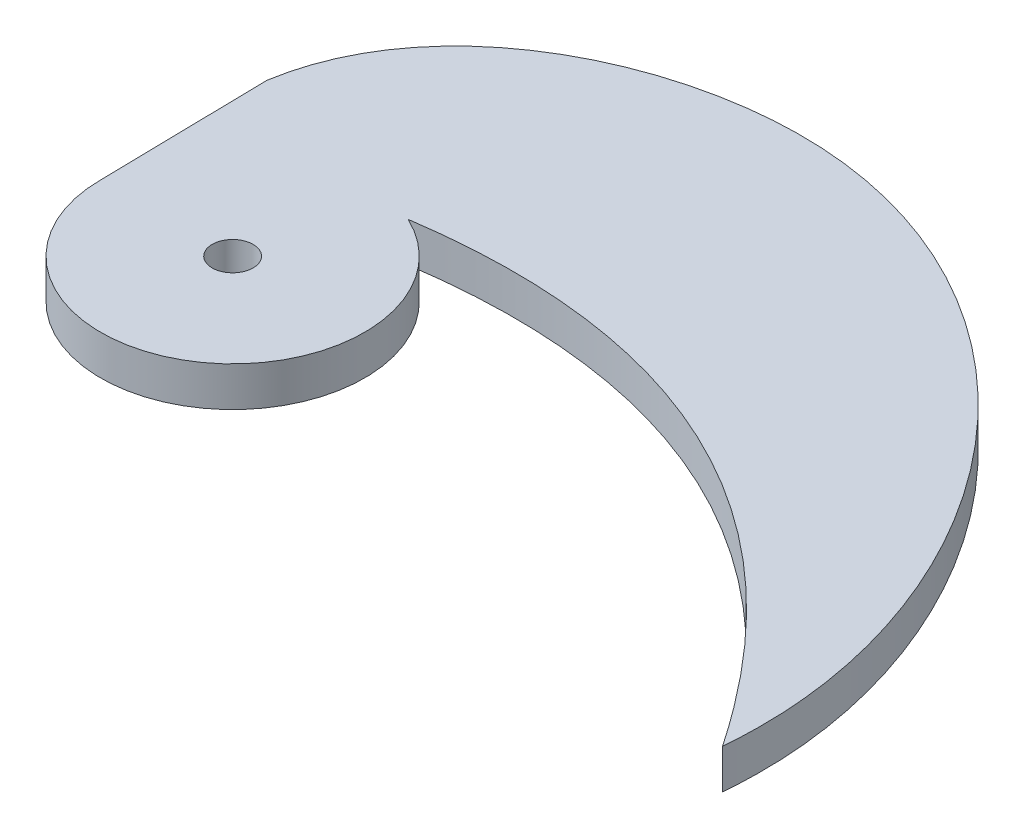
ISO-10303-21;
HEADER;
FILE_DESCRIPTION(('STEP AP214'),'2;1');
FILE_NAME('part.step','',(''),(''),'','','');
FILE_SCHEMA(('AUTOMOTIVE_DESIGN { 1 0 10303 214 1 1 1 1 }'));
ENDSEC;
DATA;
#1=APPLICATION_CONTEXT('core data for automotive mechanical design processes');
#2=APPLICATION_PROTOCOL_DEFINITION('international standard','automotive_design',2000,#1);
#3=PRODUCT_CONTEXT('',#1,'mechanical');
#4=PRODUCT('Part','Part','',(#3));
#5=PRODUCT_RELATED_PRODUCT_CATEGORY('part','',(#4));
#6=PRODUCT_DEFINITION_FORMATION('','',#4);
#7=PRODUCT_DEFINITION_CONTEXT('part definition',#1,'design');
#8=PRODUCT_DEFINITION('design','',#6,#7);
#9=PRODUCT_DEFINITION_SHAPE('','',#8);
#10=(LENGTH_UNIT() NAMED_UNIT(*) SI_UNIT(.MILLI.,.METRE.));
#11=(NAMED_UNIT(*) PLANE_ANGLE_UNIT() SI_UNIT($,.RADIAN.));
#12=(NAMED_UNIT(*) SI_UNIT($,.STERADIAN.) SOLID_ANGLE_UNIT());
#13=UNCERTAINTY_MEASURE_WITH_UNIT(LENGTH_MEASURE(1.E-05),#10,'distance_accuracy_value','');
#14=(GEOMETRIC_REPRESENTATION_CONTEXT(3) GLOBAL_UNCERTAINTY_ASSIGNED_CONTEXT((#13)) GLOBAL_UNIT_ASSIGNED_CONTEXT((#10,
#11,#12)) REPRESENTATION_CONTEXT('',''));
#15=CARTESIAN_POINT('',(0.,0.,0.));
#16=DIRECTION('',(0.,0.,1.));
#17=DIRECTION('',(1.,0.,0.));
#18=AXIS2_PLACEMENT_3D('',#15,#16,#17);
#19=CARTESIAN_POINT('',(0.,6.,0.));
#20=DIRECTION('',(0.,-1.,0.));
#21=DIRECTION('',(0.,0.,-1.));
#22=AXIS2_PLACEMENT_3D('',#19,#20,#21);
#23=CYLINDRICAL_SURFACE('',#22,20.);
#24=CARTESIAN_POINT('',(0.,0.,0.));
#25=DIRECTION('',(0.,1.,0.));
#26=DIRECTION('',(0.,0.,1.));
#27=AXIS2_PLACEMENT_3D('',#24,#25,#26);
#28=CIRCLE('',#27,20.);
#29=CARTESIAN_POINT('',(-20.,0.,0.));
#30=VERTEX_POINT('',#29);
#31=CARTESIAN_POINT('',(8.45236523481395,0.,-18.126155740733));
#32=VERTEX_POINT('',#31);
#33=EDGE_CURVE('E122',#30,#32,#28,.T.);
#34=ORIENTED_EDGE('',*,*,#33,.T.);
#35=DIRECTION('',(0.,-1.,0.));
#36=VECTOR('',#35,1.);
#37=CARTESIAN_POINT('',(8.45236523481395,6.,-18.126155740733));
#38=LINE('',#37,#36);
#39=CARTESIAN_POINT('',(8.45236523481395,6.,-18.126155740733));
#40=VERTEX_POINT('',#39);
#41=EDGE_CURVE('E11',#40,#32,#38,.T.);
#42=ORIENTED_EDGE('',*,*,#41,.F.);
#43=CARTESIAN_POINT('',(0.,6.,0.));
#44=DIRECTION('',(0.,1.,0.));
#45=DIRECTION('',(0.,0.,1.));
#46=AXIS2_PLACEMENT_3D('',#43,#44,#45);
#47=CIRCLE('',#46,20.);
#48=CARTESIAN_POINT('',(-20.,6.,0.));
#49=VERTEX_POINT('',#48);
#50=EDGE_CURVE('E85',#49,#40,#47,.T.);
#51=ORIENTED_EDGE('',*,*,#50,.F.);
#52=DIRECTION('',(0.,-1.,0.));
#53=VECTOR('',#52,1.);
#54=CARTESIAN_POINT('',(-20.,6.,0.));
#55=LINE('',#54,#53);
#56=EDGE_CURVE('E96',#49,#30,#55,.T.);
#57=ORIENTED_EDGE('',*,*,#56,.T.);
#58=EDGE_LOOP('',(#34,#42,#51,#57));
#59=FACE_BOUND('',#58,.T.);
#60=ADVANCED_FACE('F37',(#59),#23,.T.);
#61=CARTESIAN_POINT('',(8.45236523481394,6.,-18.126155740733));
#62=CARTESIAN_POINT('',(65.0149428370566,6.,-26.513222836221));
#63=CARTESIAN_POINT('',(101.422211760352,6.,27.1759997357647));
#64=B_SPLINE_CURVE_WITH_KNOTS('',2,(#61,#62,#63),.UNSPECIFIED.,.F.,.F.,(3,3),(0.,1.),.UNSPECIFIED.);
#65=DIRECTION('',(0.,-1.,0.));
#66=VECTOR('',#65,1.);
#67=SURFACE_OF_LINEAR_EXTRUSION('',#64,#66);
#68=CARTESIAN_POINT('',(8.45236523481394,0.,-18.126155740733));
#69=CARTESIAN_POINT('',(65.0149428370566,0.,-26.513222836221));
#70=CARTESIAN_POINT('',(101.422211760352,0.,27.1759997357647));
#71=B_SPLINE_CURVE_WITH_KNOTS('',2,(#68,#69,#70),.UNSPECIFIED.,.F.,.F.,(3,3),(0.,1.),.UNSPECIFIED.);
#72=CARTESIAN_POINT('',(101.422211760352,0.,27.1759997357648));
#73=VERTEX_POINT('',#72);
#74=EDGE_CURVE('E90',#32,#73,#71,.T.);
#75=ORIENTED_EDGE('',*,*,#74,.T.);
#76=DIRECTION('',(0.,-1.,0.));
#77=VECTOR('',#76,1.);
#78=CARTESIAN_POINT('',(101.422211760352,6.,27.1759997357648));
#79=LINE('',#78,#77);
#80=CARTESIAN_POINT('',(101.422211760352,6.,27.1759997357648));
#81=VERTEX_POINT('',#80);
#82=EDGE_CURVE('E46',#81,#73,#79,.T.);
#83=ORIENTED_EDGE('',*,*,#82,.F.);
#84=EDGE_CURVE('E80',#40,#81,#64,.T.);
#85=ORIENTED_EDGE('',*,*,#84,.F.);
#86=ORIENTED_EDGE('',*,*,#41,.T.);
#87=EDGE_LOOP('',(#75,#83,#85,#86));
#88=FACE_BOUND('',#87,.T.);
#89=ADVANCED_FACE('F89',(#88),#67,.F.);
#90=CARTESIAN_POINT('',(-20.4788011262157,6.,-25.6588248932317));
#91=CARTESIAN_POINT('',(-19.3693159811868,6.,-32.640094211247));
#92=CARTESIAN_POINT('',(-9.55582054644818,6.,-50.9886711432542));
#93=CARTESIAN_POINT('',(57.2952251743826,6.,-74.5843911636037));
#94=CARTESIAN_POINT('',(105.094597494465,6.,-12.8549022435383));
#95=CARTESIAN_POINT('',(101.422211760352,6.,27.1759997357648));
#96=B_SPLINE_CURVE_WITH_KNOTS('',3,(#90,#91,#92,#93,#94,#95),.UNSPECIFIED.,.F.,.F.,(4,1,1,4),
(0.0523550506600218,0.156265749931317,0.372181463072887,1.),.UNSPECIFIED.);
#97=DIRECTION('',(0.,-1.,0.));
#98=VECTOR('',#97,1.);
#99=SURFACE_OF_LINEAR_EXTRUSION('',#96,#98);
#100=CARTESIAN_POINT('',(-20.4788011262157,0.,-25.6588248932317));
#101=CARTESIAN_POINT('',(-19.3693159811868,0.,-32.640094211247));
#102=CARTESIAN_POINT('',(-9.55582054644818,0.,-50.9886711432542));
#103=CARTESIAN_POINT('',(57.2952251743826,0.,-74.5843911636037));
#104=CARTESIAN_POINT('',(105.094597494465,0.,-12.8549022435383));
#105=CARTESIAN_POINT('',(101.422211760352,0.,27.1759997357648));
#106=B_SPLINE_CURVE_WITH_KNOTS('',3,(#100,#101,#102,#103,#104,#105),.UNSPECIFIED.,.F.,.F.,(4,1,
1,4),(0.0523550506600218,0.156265749931317,0.372181463072887,1.),.UNSPECIFIED.);
#107=CARTESIAN_POINT('',(-20.4788011262157,0.,-25.6588248932317));
#108=VERTEX_POINT('',#107);
#109=EDGE_CURVE('E126',#108,#73,#106,.T.);
#110=ORIENTED_EDGE('',*,*,#109,.F.);
#111=DIRECTION('',(0.,-1.,0.));
#112=VECTOR('',#111,1.);
#113=CARTESIAN_POINT('',(-20.4788011262157,6.,-25.6588248932317));
#114=LINE('',#113,#112);
#115=CARTESIAN_POINT('',(-20.4788011262157,6.,-25.6588248932317));
#116=VERTEX_POINT('',#115);
#117=EDGE_CURVE('E70',#116,#108,#114,.T.);
#118=ORIENTED_EDGE('',*,*,#117,.F.);
#119=EDGE_CURVE('E83',#116,#81,#96,.T.);
#120=ORIENTED_EDGE('',*,*,#119,.T.);
#121=ORIENTED_EDGE('',*,*,#82,.T.);
#122=EDGE_LOOP('',(#110,#118,#120,#121));
#123=FACE_BOUND('',#122,.T.);
#124=ADVANCED_FACE('F94',(#123),#99,.T.);
#125=CARTESIAN_POINT('',(0.,6.,0.));
#126=DIRECTION('',(0.,-1.,0.));
#127=DIRECTION('',(0.,0.,-1.));
#128=AXIS2_PLACEMENT_3D('',#125,#126,#127);
#129=CYLINDRICAL_SURFACE('',#128,3.1);
#130=CARTESIAN_POINT('',(0.,6.,0.));
#131=DIRECTION('',(0.,1.,0.));
#132=DIRECTION('',(0.,0.,1.));
#133=AXIS2_PLACEMENT_3D('',#130,#131,#132);
#134=CIRCLE('',#133,3.1);
#135=CARTESIAN_POINT('',(0.,6.,3.1));
#136=VERTEX_POINT('',#135);
#137=EDGE_CURVE('E142',#136,#136,#134,.T.);
#138=ORIENTED_EDGE('',*,*,#137,.T.);
#139=EDGE_LOOP('',(#138));
#140=FACE_BOUND('',#139,.T.);
#141=CARTESIAN_POINT('',(0.,0.,0.));
#142=DIRECTION('',(0.,1.,0.));
#143=DIRECTION('',(0.,0.,1.));
#144=AXIS2_PLACEMENT_3D('',#141,#142,#143);
#145=CIRCLE('',#144,3.1);
#146=CARTESIAN_POINT('',(0.,0.,3.1));
#147=VERTEX_POINT('',#146);
#148=EDGE_CURVE('E124',#147,#147,#145,.T.);
#149=ORIENTED_EDGE('',*,*,#148,.F.);
#150=EDGE_LOOP('',(#149));
#151=FACE_BOUND('',#150,.T.);
#152=ADVANCED_FACE('F39',(#140,#151),#129,.F.);
#153=CARTESIAN_POINT('',(-19.9930382952848,6.,0.373075902426868));
#154=DIRECTION('',(0.999825942234067,0.,-0.0186570425244841));
#155=DIRECTION('',(-0.0186570425244841,0.,-0.999825942234067));
#156=AXIS2_PLACEMENT_3D('',#153,#154,#155);
#157=PLANE('',#156);
#158=DIRECTION('',(0.0186570425244841,0.,0.999825942234067));
#159=VECTOR('',#158,1.);
#160=CARTESIAN_POINT('',(-19.9930382952848,0.,0.373075902426868));
#161=LINE('',#160,#159);
#162=EDGE_CURVE('E73',#108,#30,#161,.T.);
#163=ORIENTED_EDGE('',*,*,#162,.T.);
#164=ORIENTED_EDGE('',*,*,#56,.F.);
#165=DIRECTION('',(0.0186570425244841,0.,0.999825942234067));
#166=VECTOR('',#165,1.);
#167=CARTESIAN_POINT('',(-19.9930382952848,6.,0.373075902426868));
#168=LINE('',#167,#166);
#169=EDGE_CURVE('E54',#116,#49,#168,.T.);
#170=ORIENTED_EDGE('',*,*,#169,.F.);
#171=ORIENTED_EDGE('',*,*,#117,.T.);
#172=EDGE_LOOP('',(#163,#164,#170,#171));
#173=FACE_BOUND('',#172,.T.);
#174=ADVANCED_FACE('F113',(#173),#157,.F.);
#175=CARTESIAN_POINT('',(0.,6.,0.));
#176=DIRECTION('',(0.,1.,0.));
#177=DIRECTION('',(0.,0.,1.));
#178=AXIS2_PLACEMENT_3D('',#175,#176,#177);
#179=PLANE('',#178);
#180=ORIENTED_EDGE('',*,*,#137,.F.);
#181=EDGE_LOOP('',(#180));
#182=FACE_BOUND('',#181,.T.);
#183=ORIENTED_EDGE('',*,*,#50,.T.);
#184=ORIENTED_EDGE('',*,*,#84,.T.);
#185=ORIENTED_EDGE('',*,*,#119,.F.);
#186=ORIENTED_EDGE('',*,*,#169,.T.);
#187=EDGE_LOOP('',(#183,#184,#185,#186));
#188=FACE_BOUND('',#187,.T.);
#189=ADVANCED_FACE('F81',(#182,#188),#179,.T.);
#190=CARTESIAN_POINT('',(0.,0.,0.));
#191=DIRECTION('',(0.,1.,0.));
#192=DIRECTION('',(0.,0.,1.));
#193=AXIS2_PLACEMENT_3D('',#190,#191,#192);
#194=PLANE('',#193);
#195=ORIENTED_EDGE('',*,*,#148,.T.);
#196=EDGE_LOOP('',(#195));
#197=FACE_BOUND('',#196,.T.);
#198=ORIENTED_EDGE('',*,*,#33,.F.);
#199=ORIENTED_EDGE('',*,*,#162,.F.);
#200=ORIENTED_EDGE('',*,*,#109,.T.);
#201=ORIENTED_EDGE('',*,*,#74,.F.);
#202=EDGE_LOOP('',(#198,#199,#200,#201));
#203=FACE_BOUND('',#202,.T.);
#204=ADVANCED_FACE('F151',(#197,#203),#194,.F.);
#205=CLOSED_SHELL('',(#60,#89,#124,#152,#174,#189,#204));
#206=MANIFOLD_SOLID_BREP('B2',#205);
#207=ADVANCED_BREP_SHAPE_REPRESENTATION('',(#18,#206),#14);
#208=SHAPE_DEFINITION_REPRESENTATION(#9,#207);
ENDSEC;
END-ISO-10303-21;
